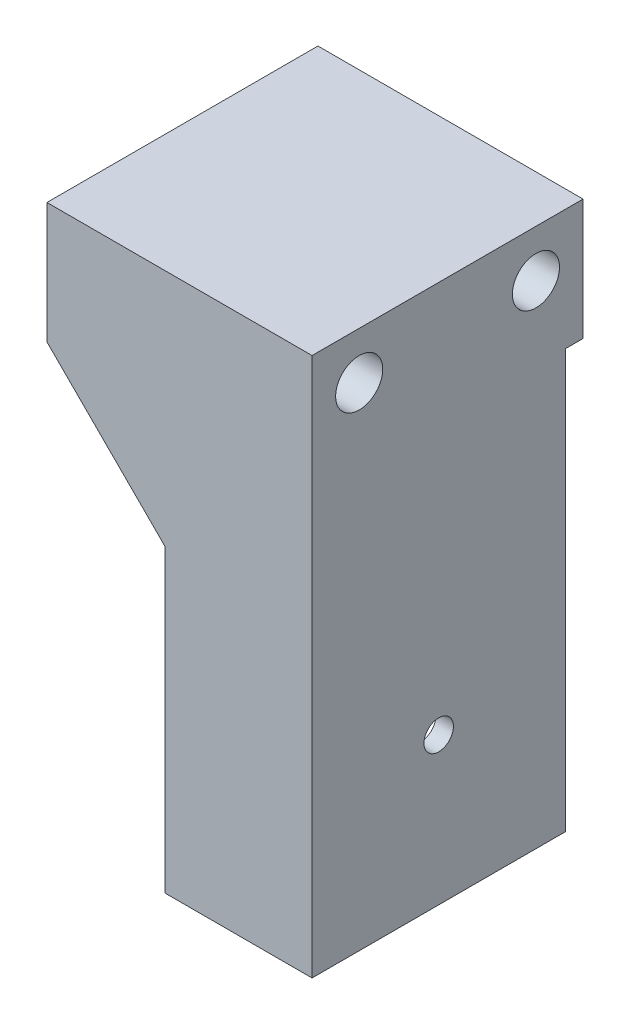
ISO-10303-21;
HEADER;
FILE_DESCRIPTION(('STEP AP214'),'2;1');
FILE_NAME('part.step','',(''),(''),'','','');
FILE_SCHEMA(('AUTOMOTIVE_DESIGN { 1 0 10303 214 1 1 1 1 }'));
ENDSEC;
DATA;
#1=APPLICATION_CONTEXT('core data for automotive mechanical design processes');
#2=APPLICATION_PROTOCOL_DEFINITION('international standard','automotive_design',2000,#1);
#3=PRODUCT_CONTEXT('',#1,'mechanical');
#4=PRODUCT('Part','Part','',(#3));
#5=PRODUCT_RELATED_PRODUCT_CATEGORY('part','',(#4));
#6=PRODUCT_DEFINITION_FORMATION('','',#4);
#7=PRODUCT_DEFINITION_CONTEXT('part definition',#1,'design');
#8=PRODUCT_DEFINITION('design','',#6,#7);
#9=PRODUCT_DEFINITION_SHAPE('','',#8);
#10=(LENGTH_UNIT() NAMED_UNIT(*) SI_UNIT(.MILLI.,.METRE.));
#11=(NAMED_UNIT(*) PLANE_ANGLE_UNIT() SI_UNIT($,.RADIAN.));
#12=(NAMED_UNIT(*) SI_UNIT($,.STERADIAN.) SOLID_ANGLE_UNIT());
#13=UNCERTAINTY_MEASURE_WITH_UNIT(LENGTH_MEASURE(1.E-05),#10,'distance_accuracy_value','');
#14=(GEOMETRIC_REPRESENTATION_CONTEXT(3) GLOBAL_UNCERTAINTY_ASSIGNED_CONTEXT((#13)) GLOBAL_UNIT_ASSIGNED_CONTEXT((#10,
#11,#12)) REPRESENTATION_CONTEXT('',''));
#15=CARTESIAN_POINT('',(0.,0.,0.));
#16=DIRECTION('',(0.,0.,1.));
#17=DIRECTION('',(1.,0.,0.));
#18=AXIS2_PLACEMENT_3D('',#15,#16,#17);
#19=CARTESIAN_POINT('',(0.,75.,-40.));
#20=DIRECTION('',(0.,0.,1.));
#21=DIRECTION('',(1.,0.,0.));
#22=AXIS2_PLACEMENT_3D('',#19,#20,#21);
#23=PLANE('',#22);
#24=DIRECTION('',(-1.,0.,0.));
#25=VECTOR('',#24,1.);
#26=CARTESIAN_POINT('',(3.,71.,-40.));
#27=LINE('',#26,#25);
#28=CARTESIAN_POINT('',(3.,71.,-40.));
#29=VERTEX_POINT('',#28);
#30=CARTESIAN_POINT('',(0.,71.,-40.));
#31=VERTEX_POINT('',#30);
#32=EDGE_CURVE('E48',#29,#31,#27,.T.);
#33=ORIENTED_EDGE('',*,*,#32,.F.);
#34=DIRECTION('',(0.,-1.,0.));
#35=VECTOR('',#34,1.);
#36=CARTESIAN_POINT('',(3.,75.,-40.));
#37=LINE('',#36,#35);
#38=CARTESIAN_POINT('',(3.,0.,-40.));
#39=VERTEX_POINT('',#38);
#40=EDGE_CURVE('E206',#29,#39,#37,.T.);
#41=ORIENTED_EDGE('',*,*,#40,.T.);
#42=DIRECTION('',(-1.,0.,0.));
#43=VECTOR('',#42,1.);
#44=CARTESIAN_POINT('',(0.,0.,-40.));
#45=LINE('',#44,#43);
#46=CARTESIAN_POINT('',(0.,0.,-40.));
#47=VERTEX_POINT('',#46);
#48=EDGE_CURVE('E196',#39,#47,#45,.T.);
#49=ORIENTED_EDGE('',*,*,#48,.T.);
#50=DIRECTION('',(0.,-1.,0.));
#51=VECTOR('',#50,1.);
#52=CARTESIAN_POINT('',(0.,75.,-40.));
#53=LINE('',#52,#51);
#54=EDGE_CURVE('E204',#31,#47,#53,.T.);
#55=ORIENTED_EDGE('',*,*,#54,.F.);
#56=EDGE_LOOP('',(#33,#41,#49,#55));
#57=FACE_BOUND('',#56,.T.);
#58=ADVANCED_FACE('F33',(#57),#23,.F.);
#59=CARTESIAN_POINT('',(-22.,75.,3.));
#60=DIRECTION('',(1.,0.,0.));
#61=DIRECTION('',(0.,0.,-1.));
#62=AXIS2_PLACEMENT_3D('',#59,#60,#61);
#63=PLANE('',#62);
#64=DIRECTION('',(0.,0.,-1.));
#65=VECTOR('',#64,1.);
#66=CARTESIAN_POINT('',(-22.,51.,3.));
#67=LINE('',#66,#65);
#68=CARTESIAN_POINT('',(-22.,51.,3.));
#69=VERTEX_POINT('',#68);
#70=CARTESIAN_POINT('',(-22.,51.,0.));
#71=VERTEX_POINT('',#70);
#72=EDGE_CURVE('E55',#69,#71,#67,.T.);
#73=ORIENTED_EDGE('',*,*,#72,.T.);
#74=DIRECTION('',(0.,-1.,0.));
#75=VECTOR('',#74,1.);
#76=CARTESIAN_POINT('',(-22.,75.,0.));
#77=LINE('',#76,#75);
#78=CARTESIAN_POINT('',(-22.,0.,0.));
#79=VERTEX_POINT('',#78);
#80=EDGE_CURVE('E11',#71,#79,#77,.T.);
#81=ORIENTED_EDGE('',*,*,#80,.T.);
#82=DIRECTION('',(0.,0.,1.));
#83=VECTOR('',#82,1.);
#84=CARTESIAN_POINT('',(-22.,0.,3.));
#85=LINE('',#84,#83);
#86=CARTESIAN_POINT('',(-22.,0.,3.));
#87=VERTEX_POINT('',#86);
#88=EDGE_CURVE('E189',#79,#87,#85,.T.);
#89=ORIENTED_EDGE('',*,*,#88,.T.);
#90=DIRECTION('',(0.,-1.,0.));
#91=VECTOR('',#90,1.);
#92=CARTESIAN_POINT('',(-22.,75.,3.));
#93=LINE('',#92,#91);
#94=EDGE_CURVE('E41',#69,#87,#93,.T.);
#95=ORIENTED_EDGE('',*,*,#94,.F.);
#96=EDGE_LOOP('',(#73,#81,#89,#95));
#97=FACE_BOUND('',#96,.T.);
#98=ADVANCED_FACE('F214',(#97),#63,.F.);
#99=CARTESIAN_POINT('',(-22.,75.,0.));
#100=DIRECTION('',(0.,0.,1.));
#101=DIRECTION('',(1.,0.,0.));
#102=AXIS2_PLACEMENT_3D('',#99,#100,#101);
#103=PLANE('',#102);
#104=DIRECTION('',(1.,0.,0.));
#105=VECTOR('',#104,1.);
#106=CARTESIAN_POINT('',(0.,71.,0.));
#107=LINE('',#106,#105);
#108=CARTESIAN_POINT('',(-42.,71.,0.));
#109=VERTEX_POINT('',#108);
#110=CARTESIAN_POINT('',(0.,71.,0.));
#111=VERTEX_POINT('',#110);
#112=EDGE_CURVE('E184',#109,#111,#107,.T.);
#113=ORIENTED_EDGE('',*,*,#112,.T.);
#114=DIRECTION('',(0.,-1.,0.));
#115=VECTOR('',#114,1.);
#116=CARTESIAN_POINT('',(0.,75.,0.));
#117=LINE('',#116,#115);
#118=CARTESIAN_POINT('',(0.,0.,0.));
#119=VERTEX_POINT('',#118);
#120=EDGE_CURVE('E202',#111,#119,#117,.T.);
#121=ORIENTED_EDGE('',*,*,#120,.T.);
#122=DIRECTION('',(-1.,0.,0.));
#123=VECTOR('',#122,1.);
#124=CARTESIAN_POINT('',(-22.,0.,0.));
#125=LINE('',#124,#123);
#126=EDGE_CURVE('E186',#119,#79,#125,.T.);
#127=ORIENTED_EDGE('',*,*,#126,.T.);
#128=ORIENTED_EDGE('',*,*,#80,.F.);
#129=DIRECTION('',(0.707106781186548,-0.707106781186547,0.));
#130=VECTOR('',#129,1.);
#131=CARTESIAN_POINT('',(-42.,71.,0.));
#132=LINE('',#131,#130);
#133=EDGE_CURVE('E163',#109,#71,#132,.T.);
#134=ORIENTED_EDGE('',*,*,#133,.F.);
#135=EDGE_LOOP('',(#113,#121,#127,#128,#134));
#136=FACE_BOUND('',#135,.T.);
#137=ADVANCED_FACE('F35',(#136),#103,.F.);
#138=CARTESIAN_POINT('',(0.,75.,0.));
#139=DIRECTION('',(1.,0.,0.));
#140=DIRECTION('',(0.,0.,-1.));
#141=AXIS2_PLACEMENT_3D('',#138,#139,#140);
#142=PLANE('',#141);
#143=CARTESIAN_POINT('',(0.,25.,-18.5));
#144=DIRECTION('',(1.,0.,0.));
#145=DIRECTION('',(0.,0.,-1.));
#146=AXIS2_PLACEMENT_3D('',#143,#144,#145);
#147=CIRCLE('',#146,2.5);
#148=CARTESIAN_POINT('',(0.,25.,-21.));
#149=VERTEX_POINT('',#148);
#150=EDGE_CURVE('E160',#149,#149,#147,.T.);
#151=ORIENTED_EDGE('',*,*,#150,.T.);
#152=EDGE_LOOP('',(#151));
#153=FACE_BOUND('',#152,.T.);
#154=DIRECTION('',(0.,0.,-1.));
#155=VECTOR('',#154,1.);
#156=CARTESIAN_POINT('',(0.,71.,0.));
#157=LINE('',#156,#155);
#158=EDGE_CURVE('E180',#111,#31,#157,.T.);
#159=ORIENTED_EDGE('',*,*,#158,.T.);
#160=ORIENTED_EDGE('',*,*,#54,.T.);
#161=DIRECTION('',(0.,0.,1.));
#162=VECTOR('',#161,1.);
#163=CARTESIAN_POINT('',(0.,0.,0.));
#164=LINE('',#163,#162);
#165=EDGE_CURVE('E199',#47,#119,#164,.T.);
#166=ORIENTED_EDGE('',*,*,#165,.T.);
#167=ORIENTED_EDGE('',*,*,#120,.F.);
#168=EDGE_LOOP('',(#159,#160,#166,#167));
#169=FACE_BOUND('',#168,.T.);
#170=ADVANCED_FACE('F233',(#153,#169),#142,.F.);
#171=CARTESIAN_POINT('',(3.00000000000001,75.,3.));
#172=DIRECTION('',(0.,0.,-1.));
#173=DIRECTION('',(-1.,0.,0.));
#174=AXIS2_PLACEMENT_3D('',#171,#172,#173);
#175=PLANE('',#174);
#176=DIRECTION('',(1.,0.,0.));
#177=VECTOR('',#176,1.);
#178=CARTESIAN_POINT('',(3.00000000000001,0.,3.));
#179=LINE('',#178,#177);
#180=CARTESIAN_POINT('',(3.00000000000001,0.,3.));
#181=VERTEX_POINT('',#180);
#182=EDGE_CURVE('E192',#87,#181,#179,.T.);
#183=ORIENTED_EDGE('',*,*,#182,.T.);
#184=DIRECTION('',(0.,-1.,0.));
#185=VECTOR('',#184,1.);
#186=CARTESIAN_POINT('',(3.00000000000001,75.,3.));
#187=LINE('',#186,#185);
#188=CARTESIAN_POINT('',(3.00000000000001,91.5,3.));
#189=VERTEX_POINT('',#188);
#190=EDGE_CURVE('E208',#189,#181,#187,.T.);
#191=ORIENTED_EDGE('',*,*,#190,.F.);
#192=DIRECTION('',(-1.,0.,0.));
#193=VECTOR('',#192,1.);
#194=CARTESIAN_POINT('',(49.0570298651574,91.5,3.));
#195=LINE('',#194,#193);
#196=CARTESIAN_POINT('',(-42.,91.5,3.));
#197=VERTEX_POINT('',#196);
#198=EDGE_CURVE('E115',#189,#197,#195,.T.);
#199=ORIENTED_EDGE('',*,*,#198,.T.);
#200=DIRECTION('',(0.,-1.,0.));
#201=VECTOR('',#200,1.);
#202=CARTESIAN_POINT('',(-42.,75.,3.));
#203=LINE('',#202,#201);
#204=CARTESIAN_POINT('',(-42.,71.,3.));
#205=VERTEX_POINT('',#204);
#206=EDGE_CURVE('E166',#197,#205,#203,.T.);
#207=ORIENTED_EDGE('',*,*,#206,.T.);
#208=DIRECTION('',(0.707106781186548,-0.707106781186547,0.));
#209=VECTOR('',#208,1.);
#210=CARTESIAN_POINT('',(-42.,71.,3.));
#211=LINE('',#210,#209);
#212=EDGE_CURVE('E168',#205,#69,#211,.T.);
#213=ORIENTED_EDGE('',*,*,#212,.T.);
#214=ORIENTED_EDGE('',*,*,#94,.T.);
#215=EDGE_LOOP('',(#183,#191,#199,#207,#213,#214));
#216=FACE_BOUND('',#215,.T.);
#217=ADVANCED_FACE('F210',(#216),#175,.F.);
#218=CARTESIAN_POINT('',(3.,75.,-40.));
#219=DIRECTION('',(-1.,0.,0.));
#220=DIRECTION('',(0.,0.,1.));
#221=AXIS2_PLACEMENT_3D('',#218,#219,#220);
#222=PLANE('',#221);
#223=CARTESIAN_POINT('',(3.,25.,-18.5));
#224=DIRECTION('',(1.,0.,0.));
#225=DIRECTION('',(0.,0.,-1.));
#226=AXIS2_PLACEMENT_3D('',#223,#224,#225);
#227=CIRCLE('',#226,2.5);
#228=CARTESIAN_POINT('',(3.,25.,-21.));
#229=VERTEX_POINT('',#228);
#230=EDGE_CURVE('E159',#229,#229,#227,.T.);
#231=ORIENTED_EDGE('',*,*,#230,.F.);
#232=EDGE_LOOP('',(#231));
#233=FACE_BOUND('',#232,.T.);
#234=DIRECTION('',(0.,0.,-1.));
#235=VECTOR('',#234,1.);
#236=CARTESIAN_POINT('',(3.,0.,-40.));
#237=LINE('',#236,#235);
#238=EDGE_CURVE('E194',#181,#39,#237,.T.);
#239=ORIENTED_EDGE('',*,*,#238,.T.);
#240=ORIENTED_EDGE('',*,*,#40,.F.);
#241=DIRECTION('',(0.,0.,1.));
#242=VECTOR('',#241,1.);
#243=CARTESIAN_POINT('',(3.,71.,-43.));
#244=LINE('',#243,#242);
#245=CARTESIAN_POINT('',(3.,71.,-43.));
#246=VERTEX_POINT('',#245);
#247=EDGE_CURVE('E126',#246,#29,#244,.T.);
#248=ORIENTED_EDGE('',*,*,#247,.F.);
#249=DIRECTION('',(0.,-1.,0.));
#250=VECTOR('',#249,1.);
#251=CARTESIAN_POINT('',(3.,91.5,-43.));
#252=LINE('',#251,#250);
#253=CARTESIAN_POINT('',(3.,91.5,-43.));
#254=VERTEX_POINT('',#253);
#255=EDGE_CURVE('E121',#254,#246,#252,.T.);
#256=ORIENTED_EDGE('',*,*,#255,.F.);
#257=DIRECTION('',(0.,0.,1.));
#258=VECTOR('',#257,1.);
#259=CARTESIAN_POINT('',(3.,91.5,-40.));
#260=LINE('',#259,#258);
#261=EDGE_CURVE('E108',#254,#189,#260,.T.);
#262=ORIENTED_EDGE('',*,*,#261,.T.);
#263=ORIENTED_EDGE('',*,*,#190,.T.);
#264=EDGE_LOOP('',(#239,#240,#248,#256,#262,#263));
#265=FACE_BOUND('',#264,.T.);
#266=CARTESIAN_POINT('',(3.00000000000001,83.5,-5.));
#267=DIRECTION('',(-1.,0.,0.));
#268=DIRECTION('',(0.,0.,1.));
#269=AXIS2_PLACEMENT_3D('',#266,#267,#268);
#270=CIRCLE('',#269,4.00000000000001);
#271=CARTESIAN_POINT('',(3.00000000000001,83.5,-0.999999999999992));
#272=VERTEX_POINT('',#271);
#273=EDGE_CURVE('E118',#272,#272,#270,.F.);
#274=ORIENTED_EDGE('',*,*,#273,.F.);
#275=EDGE_LOOP('',(#274));
#276=FACE_BOUND('',#275,.T.);
#277=CARTESIAN_POINT('',(3.,83.5,-35.));
#278=DIRECTION('',(-1.,0.,0.));
#279=DIRECTION('',(0.,0.,1.));
#280=AXIS2_PLACEMENT_3D('',#277,#278,#279);
#281=CIRCLE('',#280,4.00000000000001);
#282=CARTESIAN_POINT('',(3.,83.5,-31.));
#283=VERTEX_POINT('',#282);
#284=EDGE_CURVE('E143',#283,#283,#281,.F.);
#285=ORIENTED_EDGE('',*,*,#284,.F.);
#286=EDGE_LOOP('',(#285));
#287=FACE_BOUND('',#286,.T.);
#288=ADVANCED_FACE('F123',(#233,#265,#276,#287),#222,.F.);
#289=CARTESIAN_POINT('',(0.,0.,0.));
#290=DIRECTION('',(0.,1.,0.));
#291=DIRECTION('',(0.,0.,1.));
#292=AXIS2_PLACEMENT_3D('',#289,#290,#291);
#293=PLANE('',#292);
#294=ORIENTED_EDGE('',*,*,#126,.F.);
#295=ORIENTED_EDGE('',*,*,#165,.F.);
#296=ORIENTED_EDGE('',*,*,#48,.F.);
#297=ORIENTED_EDGE('',*,*,#238,.F.);
#298=ORIENTED_EDGE('',*,*,#182,.F.);
#299=ORIENTED_EDGE('',*,*,#88,.F.);
#300=EDGE_LOOP('',(#294,#295,#296,#297,#298,#299));
#301=FACE_BOUND('',#300,.T.);
#302=ADVANCED_FACE('F218',(#301),#293,.F.);
#303=CARTESIAN_POINT('',(-42.,71.,0.));
#304=DIRECTION('',(-1.,0.,0.));
#305=DIRECTION('',(0.,0.,1.));
#306=AXIS2_PLACEMENT_3D('',#303,#304,#305);
#307=PLANE('',#306);
#308=ORIENTED_EDGE('',*,*,#206,.F.);
#309=DIRECTION('',(0.,0.,-1.));
#310=VECTOR('',#309,1.);
#311=CARTESIAN_POINT('',(-42.,91.5,-40.));
#312=LINE('',#311,#310);
#313=CARTESIAN_POINT('',(-42.,91.5,-43.));
#314=VERTEX_POINT('',#313);
#315=EDGE_CURVE('E152',#197,#314,#312,.T.);
#316=ORIENTED_EDGE('',*,*,#315,.T.);
#317=DIRECTION('',(0.,1.,0.));
#318=VECTOR('',#317,1.);
#319=CARTESIAN_POINT('',(-42.,71.,-43.));
#320=LINE('',#319,#318);
#321=CARTESIAN_POINT('',(-42.,71.,-43.));
#322=VERTEX_POINT('',#321);
#323=EDGE_CURVE('E135',#322,#314,#320,.T.);
#324=ORIENTED_EDGE('',*,*,#323,.F.);
#325=DIRECTION('',(0.,0.,1.));
#326=VECTOR('',#325,1.);
#327=CARTESIAN_POINT('',(-42.,71.,0.));
#328=LINE('',#327,#326);
#329=EDGE_CURVE('E182',#322,#109,#328,.T.);
#330=ORIENTED_EDGE('',*,*,#329,.T.);
#331=DIRECTION('',(0.,0.,-1.));
#332=VECTOR('',#331,1.);
#333=CARTESIAN_POINT('',(-42.,71.,3.));
#334=LINE('',#333,#332);
#335=EDGE_CURVE('E174',#205,#109,#334,.T.);
#336=ORIENTED_EDGE('',*,*,#335,.F.);
#337=EDGE_LOOP('',(#308,#316,#324,#330,#336));
#338=FACE_BOUND('',#337,.T.);
#339=CARTESIAN_POINT('',(-42.,83.5,-5.));
#340=DIRECTION('',(-1.,0.,0.));
#341=DIRECTION('',(0.,0.,1.));
#342=AXIS2_PLACEMENT_3D('',#339,#340,#341);
#343=CIRCLE('',#342,4.00000000000001);
#344=CARTESIAN_POINT('',(-42.,83.5,-0.999999999999992));
#345=VERTEX_POINT('',#344);
#346=EDGE_CURVE('E142',#345,#345,#343,.T.);
#347=ORIENTED_EDGE('',*,*,#346,.F.);
#348=EDGE_LOOP('',(#347));
#349=FACE_BOUND('',#348,.T.);
#350=CARTESIAN_POINT('',(-42.,83.5,-35.));
#351=DIRECTION('',(-1.,0.,0.));
#352=DIRECTION('',(0.,0.,1.));
#353=AXIS2_PLACEMENT_3D('',#350,#351,#352);
#354=CIRCLE('',#353,4.00000000000001);
#355=CARTESIAN_POINT('',(-42.,83.5,-31.));
#356=VERTEX_POINT('',#355);
#357=EDGE_CURVE('E149',#356,#356,#354,.T.);
#358=ORIENTED_EDGE('',*,*,#357,.F.);
#359=EDGE_LOOP('',(#358));
#360=FACE_BOUND('',#359,.T.);
#361=ADVANCED_FACE('F223',(#338,#349,#360),#307,.T.);
#362=CARTESIAN_POINT('',(0.,71.,0.));
#363=DIRECTION('',(0.,1.,0.));
#364=DIRECTION('',(0.,0.,1.));
#365=AXIS2_PLACEMENT_3D('',#362,#363,#364);
#366=PLANE('',#365);
#367=CARTESIAN_POINT('',(-17.,71.,-20.));
#368=DIRECTION('',(0.,1.,0.));
#369=DIRECTION('',(0.,0.,1.));
#370=AXIS2_PLACEMENT_3D('',#367,#368,#369);
#371=CIRCLE('',#370,2.5);
#372=CARTESIAN_POINT('',(-17.,71.,-17.5));
#373=VERTEX_POINT('',#372);
#374=EDGE_CURVE('E177',#373,#373,#371,.T.);
#375=ORIENTED_EDGE('',*,*,#374,.T.);
#376=EDGE_LOOP('',(#375));
#377=FACE_BOUND('',#376,.T.);
#378=ORIENTED_EDGE('',*,*,#158,.F.);
#379=ORIENTED_EDGE('',*,*,#112,.F.);
#380=ORIENTED_EDGE('',*,*,#329,.F.);
#381=DIRECTION('',(-1.,0.,0.));
#382=VECTOR('',#381,1.);
#383=CARTESIAN_POINT('',(3.,71.,-43.));
#384=LINE('',#383,#382);
#385=EDGE_CURVE('E130',#246,#322,#384,.T.);
#386=ORIENTED_EDGE('',*,*,#385,.F.);
#387=ORIENTED_EDGE('',*,*,#247,.T.);
#388=ORIENTED_EDGE('',*,*,#32,.T.);
#389=EDGE_LOOP('',(#378,#379,#380,#386,#387,#388));
#390=FACE_BOUND('',#389,.T.);
#391=ADVANCED_FACE('F273',(#377,#390),#366,.F.);
#392=CARTESIAN_POINT('',(-17.,71.,-20.));
#393=DIRECTION('',(0.,1.,0.));
#394=DIRECTION('',(0.,0.,1.));
#395=AXIS2_PLACEMENT_3D('',#392,#393,#394);
#396=CYLINDRICAL_SURFACE('',#395,2.5);
#397=ORIENTED_EDGE('',*,*,#374,.F.);
#398=EDGE_LOOP('',(#397));
#399=FACE_BOUND('',#398,.T.);
#400=CARTESIAN_POINT('',(-17.,75.,-20.));
#401=DIRECTION('',(0.,-1.,0.));
#402=DIRECTION('',(0.,0.,-1.));
#403=AXIS2_PLACEMENT_3D('',#400,#401,#402);
#404=CIRCLE('',#403,2.5);
#405=CARTESIAN_POINT('',(-17.,75.,-22.5));
#406=VERTEX_POINT('',#405);
#407=EDGE_CURVE('E145',#406,#406,#404,.F.);
#408=ORIENTED_EDGE('',*,*,#407,.T.);
#409=EDGE_LOOP('',(#408));
#410=FACE_BOUND('',#409,.T.);
#411=ADVANCED_FACE('F267',(#399,#410),#396,.F.);
#412=CARTESIAN_POINT('',(-42.,71.,3.));
#413=DIRECTION('',(0.707106781186547,0.707106781186548,0.));
#414=DIRECTION('',(-0.707106781186548,0.707106781186547,0.));
#415=AXIS2_PLACEMENT_3D('',#412,#413,#414);
#416=PLANE('',#415);
#417=ORIENTED_EDGE('',*,*,#133,.T.);
#418=ORIENTED_EDGE('',*,*,#72,.F.);
#419=ORIENTED_EDGE('',*,*,#212,.F.);
#420=ORIENTED_EDGE('',*,*,#335,.T.);
#421=EDGE_LOOP('',(#417,#418,#419,#420));
#422=FACE_BOUND('',#421,.T.);
#423=ADVANCED_FACE('F228',(#422),#416,.F.);
#424=CARTESIAN_POINT('',(0.,25.,-18.5));
#425=DIRECTION('',(1.,0.,0.));
#426=DIRECTION('',(0.,0.,-1.));
#427=AXIS2_PLACEMENT_3D('',#424,#425,#426);
#428=CYLINDRICAL_SURFACE('',#427,2.5);
#429=ORIENTED_EDGE('',*,*,#150,.F.);
#430=EDGE_LOOP('',(#429));
#431=FACE_BOUND('',#430,.T.);
#432=ORIENTED_EDGE('',*,*,#230,.T.);
#433=EDGE_LOOP('',(#432));
#434=FACE_BOUND('',#433,.T.);
#435=ADVANCED_FACE('F255',(#431,#434),#428,.F.);
#436=CARTESIAN_POINT('',(49.0570298651574,75.,3.));
#437=DIRECTION('',(0.,-1.,0.));
#438=DIRECTION('',(0.,0.,-1.));
#439=AXIS2_PLACEMENT_3D('',#436,#437,#438);
#440=PLANE('',#439);
#441=ORIENTED_EDGE('',*,*,#407,.F.);
#442=EDGE_LOOP('',(#441));
#443=FACE_BOUND('',#442,.T.);
#444=ADVANCED_FACE('F258',(#443),#440,.T.);
#445=CARTESIAN_POINT('',(49.0570298651574,91.5,-40.));
#446=DIRECTION('',(0.,1.,0.));
#447=DIRECTION('',(0.,0.,1.));
#448=AXIS2_PLACEMENT_3D('',#445,#446,#447);
#449=PLANE('',#448);
#450=ORIENTED_EDGE('',*,*,#261,.F.);
#451=DIRECTION('',(1.,0.,0.));
#452=VECTOR('',#451,1.);
#453=CARTESIAN_POINT('',(-42.,91.5,-43.));
#454=LINE('',#453,#452);
#455=EDGE_CURVE('E113',#314,#254,#454,.T.);
#456=ORIENTED_EDGE('',*,*,#455,.F.);
#457=ORIENTED_EDGE('',*,*,#315,.F.);
#458=ORIENTED_EDGE('',*,*,#198,.F.);
#459=EDGE_LOOP('',(#450,#456,#457,#458));
#460=FACE_BOUND('',#459,.T.);
#461=ADVANCED_FACE('F110',(#460),#449,.T.);
#462=CARTESIAN_POINT('',(49.0570298651574,83.5,-35.));
#463=DIRECTION('',(-1.,0.,0.));
#464=DIRECTION('',(0.,0.,1.));
#465=AXIS2_PLACEMENT_3D('',#462,#463,#464);
#466=CYLINDRICAL_SURFACE('',#465,4.00000000000001);
#467=ORIENTED_EDGE('',*,*,#284,.T.);
#468=EDGE_LOOP('',(#467));
#469=FACE_BOUND('',#468,.T.);
#470=ORIENTED_EDGE('',*,*,#357,.T.);
#471=EDGE_LOOP('',(#470));
#472=FACE_BOUND('',#471,.T.);
#473=ADVANCED_FACE('F330',(#469,#472),#466,.F.);
#474=CARTESIAN_POINT('',(49.0570298651574,83.5,-5.));
#475=DIRECTION('',(-1.,0.,0.));
#476=DIRECTION('',(0.,0.,1.));
#477=AXIS2_PLACEMENT_3D('',#474,#475,#476);
#478=CYLINDRICAL_SURFACE('',#477,4.00000000000001);
#479=ORIENTED_EDGE('',*,*,#273,.T.);
#480=EDGE_LOOP('',(#479));
#481=FACE_BOUND('',#480,.T.);
#482=ORIENTED_EDGE('',*,*,#346,.T.);
#483=EDGE_LOOP('',(#482));
#484=FACE_BOUND('',#483,.T.);
#485=ADVANCED_FACE('F335',(#481,#484),#478,.F.);
#486=CARTESIAN_POINT('',(0.,0.,-43.));
#487=DIRECTION('',(0.,0.,-1.));
#488=DIRECTION('',(-1.,0.,0.));
#489=AXIS2_PLACEMENT_3D('',#486,#487,#488);
#490=PLANE('',#489);
#491=ORIENTED_EDGE('',*,*,#455,.T.);
#492=ORIENTED_EDGE('',*,*,#255,.T.);
#493=ORIENTED_EDGE('',*,*,#385,.T.);
#494=ORIENTED_EDGE('',*,*,#323,.T.);
#495=EDGE_LOOP('',(#491,#492,#493,#494));
#496=FACE_BOUND('',#495,.T.);
#497=ADVANCED_FACE('F133',(#496),#490,.T.);
#498=CLOSED_SHELL('',(#58,#98,#137,#170,#217,#288,#302,#361,#391,#411,#423,#435,#444,#461,#473,
#485,#497));
#499=MANIFOLD_SOLID_BREP('B2',#498);
#500=ADVANCED_BREP_SHAPE_REPRESENTATION('',(#18,#499),#14);
#501=SHAPE_DEFINITION_REPRESENTATION(#9,#500);
ENDSEC;
END-ISO-10303-21;
